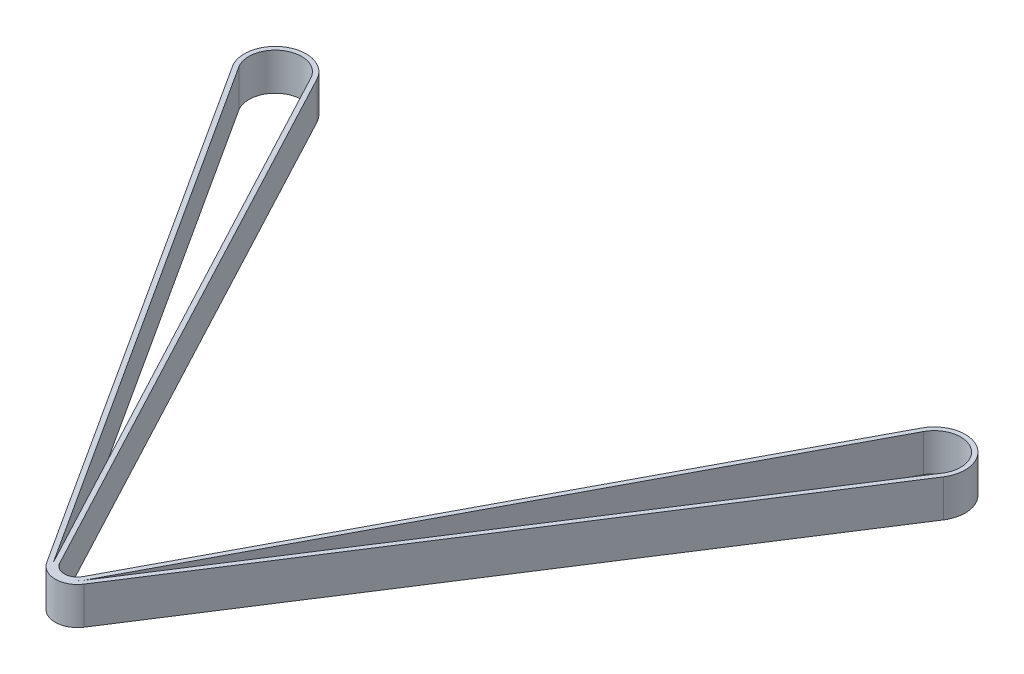
ISO-10303-21;
HEADER;
FILE_DESCRIPTION(('STEP AP214'),'2;1');
FILE_NAME('part.step','',(''),(''),'','','');
FILE_SCHEMA(('AUTOMOTIVE_DESIGN { 1 0 10303 214 1 1 1 1 }'));
ENDSEC;
DATA;
#1=APPLICATION_CONTEXT('core data for automotive mechanical design processes');
#2=APPLICATION_PROTOCOL_DEFINITION('international standard','automotive_design',2000,#1);
#3=PRODUCT_CONTEXT('',#1,'mechanical');
#4=PRODUCT('Part','Part','',(#3));
#5=PRODUCT_RELATED_PRODUCT_CATEGORY('part','',(#4));
#6=PRODUCT_DEFINITION_FORMATION('','',#4);
#7=PRODUCT_DEFINITION_CONTEXT('part definition',#1,'design');
#8=PRODUCT_DEFINITION('design','',#6,#7);
#9=PRODUCT_DEFINITION_SHAPE('','',#8);
#10=(LENGTH_UNIT() NAMED_UNIT(*) SI_UNIT(.MILLI.,.METRE.));
#11=(NAMED_UNIT(*) PLANE_ANGLE_UNIT() SI_UNIT($,.RADIAN.));
#12=(NAMED_UNIT(*) SI_UNIT($,.STERADIAN.) SOLID_ANGLE_UNIT());
#13=UNCERTAINTY_MEASURE_WITH_UNIT(LENGTH_MEASURE(1.E-05),#10,'distance_accuracy_value','');
#14=(GEOMETRIC_REPRESENTATION_CONTEXT(3) GLOBAL_UNCERTAINTY_ASSIGNED_CONTEXT((#13)) GLOBAL_UNIT_ASSIGNED_CONTEXT((#10,
#11,#12)) REPRESENTATION_CONTEXT('',''));
#15=CARTESIAN_POINT('',(0.,0.,0.));
#16=DIRECTION('',(0.,0.,1.));
#17=DIRECTION('',(1.,0.,0.));
#18=AXIS2_PLACEMENT_3D('',#15,#16,#17);
#19=CARTESIAN_POINT('',(0.,2.835,80.));
#20=DIRECTION('',(0.,1.,0.));
#21=DIRECTION('',(0.,0.,1.));
#22=AXIS2_PLACEMENT_3D('',#19,#20,#21);
#23=PLANE('',#22);
#24=CARTESIAN_POINT('',(0.,2.835,80.));
#25=DIRECTION('',(0.,1.,0.));
#26=DIRECTION('',(0.,0.,1.));
#27=AXIS2_PLACEMENT_3D('',#24,#25,#26);
#28=CIRCLE('',#27,3.38099999999999);
#29=CARTESIAN_POINT('',(-2.84194261261278,2.835,81.831535745383));
#30=VERTEX_POINT('',#29);
#31=CARTESIAN_POINT('',(2.84194261261276,2.835,81.831535745383));
#32=VERTEX_POINT('',#31);
#33=EDGE_CURVE('E262',#30,#32,#28,.T.);
#34=ORIENTED_EDGE('',*,*,#33,.T.);
#35=DIRECTION('',(0.54171421040609,0.,-0.840562736649744));
#36=VECTOR('',#35,1.);
#37=CARTESIAN_POINT('',(53.9422392348873,2.835,2.54063964680456));
#38=LINE('',#37,#36);
#39=CARTESIAN_POINT('',(53.9422392348873,2.835,2.54063964680456));
#40=VERTEX_POINT('',#39);
#41=EDGE_CURVE('E266',#32,#40,#38,.T.);
#42=ORIENTED_EDGE('',*,*,#41,.T.);
#43=CARTESIAN_POINT('',(50.,2.835,0.));
#44=DIRECTION('',(0.,1.,0.));
#45=DIRECTION('',(0.,0.,1.));
#46=AXIS2_PLACEMENT_3D('',#43,#44,#45);
#47=CIRCLE('',#46,4.69);
#48=CARTESIAN_POINT('',(45.85663033452,2.835,-2.19740479092502));
#49=VERTEX_POINT('',#48);
#50=EDGE_CURVE('E270',#40,#49,#47,.T.);
#51=ORIENTED_EDGE('',*,*,#50,.T.);
#52=DIRECTION('',(-0.468529806167377,0.,0.883447689867804));
#53=VECTOR('',#52,1.);
#54=CARTESIAN_POINT('',(1.76689537973561,2.835,80.9370596123348));
#55=LINE('',#54,#53);
#56=CARTESIAN_POINT('',(1.7668953797356,2.835,80.9370596123348));
#57=VERTEX_POINT('',#56);
#58=EDGE_CURVE('E273',#49,#57,#55,.T.);
#59=ORIENTED_EDGE('',*,*,#58,.T.);
#60=CARTESIAN_POINT('',(0.,2.835,80.));
#61=DIRECTION('',(0.,-1.,0.));
#62=DIRECTION('',(0.,0.,1.));
#63=AXIS2_PLACEMENT_3D('',#60,#61,#62);
#64=CIRCLE('',#63,2.);
#65=CARTESIAN_POINT('',(-1.76689537973559,2.835,80.9370596123348));
#66=VERTEX_POINT('',#65);
#67=EDGE_CURVE('E276',#57,#66,#64,.T.);
#68=ORIENTED_EDGE('',*,*,#67,.T.);
#69=DIRECTION('',(-0.468529806167378,0.,-0.883447689867804));
#70=VECTOR('',#69,1.);
#71=CARTESIAN_POINT('',(-45.85663033452,2.835,-2.197404790925));
#72=LINE('',#71,#70);
#73=CARTESIAN_POINT('',(-45.85663033452,2.835,-2.197404790925));
#74=VERTEX_POINT('',#73);
#75=EDGE_CURVE('E279',#66,#74,#72,.T.);
#76=ORIENTED_EDGE('',*,*,#75,.T.);
#77=CARTESIAN_POINT('',(-50.,2.835,0.));
#78=DIRECTION('',(0.,1.,0.));
#79=DIRECTION('',(0.,0.,1.));
#80=AXIS2_PLACEMENT_3D('',#77,#78,#79);
#81=CIRCLE('',#80,4.69);
#82=CARTESIAN_POINT('',(-53.9422392348873,2.835,2.54063964680456));
#83=VERTEX_POINT('',#82);
#84=EDGE_CURVE('E282',#74,#83,#81,.T.);
#85=ORIENTED_EDGE('',*,*,#84,.T.);
#86=DIRECTION('',(0.54171421040609,0.,0.840562736649744));
#87=VECTOR('',#86,1.);
#88=CARTESIAN_POINT('',(-2.84194261261278,2.835,81.831535745383));
#89=LINE('',#88,#87);
#90=EDGE_CURVE('E285',#83,#30,#89,.T.);
#91=ORIENTED_EDGE('',*,*,#90,.T.);
#92=EDGE_LOOP('',(#34,#42,#51,#59,#68,#76,#85,#91));
#93=FACE_BOUND('',#92,.T.);
#94=DIRECTION('',(0.54171421040609,0.,-0.840562736649744));
#95=VECTOR('',#94,1.);
#96=CARTESIAN_POINT('',(53.362250946599,2.835,2.16685684162436));
#97=LINE('',#96,#95);
#98=CARTESIAN_POINT('',(2.26195432432444,2.835,81.4577529402028));
#99=VERTEX_POINT('',#98);
#100=CARTESIAN_POINT('',(53.362250946599,2.835,2.16685684162436));
#101=VERTEX_POINT('',#100);
#102=EDGE_CURVE('E182',#99,#101,#97,.T.);
#103=ORIENTED_EDGE('',*,*,#102,.F.);
#104=CARTESIAN_POINT('',(0.,2.835,80.));
#105=DIRECTION('',(0.,1.,0.));
#106=DIRECTION('',(0.,0.,1.));
#107=AXIS2_PLACEMENT_3D('',#104,#105,#106);
#108=CIRCLE('',#107,2.691);
#109=CARTESIAN_POINT('',(-2.26195432432446,2.835,81.4577529402028));
#110=VERTEX_POINT('',#109);
#111=EDGE_CURVE('E173',#110,#99,#108,.T.);
#112=ORIENTED_EDGE('',*,*,#111,.F.);
#113=DIRECTION('',(0.54171421040609,0.,0.840562736649744));
#114=VECTOR('',#113,1.);
#115=CARTESIAN_POINT('',(-2.26195432432446,2.835,81.4577529402028));
#116=LINE('',#115,#114);
#117=CARTESIAN_POINT('',(-53.362250946599,2.835,2.16685684162436));
#118=VERTEX_POINT('',#117);
#119=EDGE_CURVE('E214',#118,#110,#116,.T.);
#120=ORIENTED_EDGE('',*,*,#119,.F.);
#121=CARTESIAN_POINT('',(-50.,2.835,0.));
#122=DIRECTION('',(0.,1.,0.));
#123=DIRECTION('',(0.,0.,1.));
#124=AXIS2_PLACEMENT_3D('',#121,#122,#123);
#125=CIRCLE('',#124,4.);
#126=CARTESIAN_POINT('',(-46.4662092405288,2.835,-1.87411922466951));
#127=VERTEX_POINT('',#126);
#128=EDGE_CURVE('E211',#127,#118,#125,.T.);
#129=ORIENTED_EDGE('',*,*,#128,.F.);
#130=DIRECTION('',(-0.468529806167378,0.,-0.883447689867804));
#131=VECTOR('',#130,1.);
#132=CARTESIAN_POINT('',(-46.4662092405288,2.835,-1.87411922466951));
#133=LINE('',#132,#131);
#134=CARTESIAN_POINT('',(-2.37647428574438,2.835,81.2603451785903));
#135=VERTEX_POINT('',#134);
#136=EDGE_CURVE('E208',#135,#127,#133,.T.);
#137=ORIENTED_EDGE('',*,*,#136,.F.);
#138=CARTESIAN_POINT('',(0.,2.835,80.));
#139=DIRECTION('',(0.,-1.,0.));
#140=DIRECTION('',(0.,0.,1.));
#141=AXIS2_PLACEMENT_3D('',#138,#139,#140);
#142=CIRCLE('',#141,2.69);
#143=CARTESIAN_POINT('',(2.37647428574439,2.835,81.2603451785903));
#144=VERTEX_POINT('',#143);
#145=EDGE_CURVE('E205',#144,#135,#142,.T.);
#146=ORIENTED_EDGE('',*,*,#145,.F.);
#147=DIRECTION('',(-0.468529806167377,0.,0.883447689867804));
#148=VECTOR('',#147,1.);
#149=CARTESIAN_POINT('',(2.37647428574439,2.835,81.2603451785903));
#150=LINE('',#149,#148);
#151=CARTESIAN_POINT('',(46.4662092405288,2.835,-1.87411922466953));
#152=VERTEX_POINT('',#151);
#153=EDGE_CURVE('E200',#152,#144,#150,.T.);
#154=ORIENTED_EDGE('',*,*,#153,.F.);
#155=CARTESIAN_POINT('',(50.,2.835,0.));
#156=DIRECTION('',(0.,1.,0.));
#157=DIRECTION('',(0.,0.,1.));
#158=AXIS2_PLACEMENT_3D('',#155,#156,#157);
#159=CIRCLE('',#158,4.);
#160=EDGE_CURVE('E196',#101,#152,#159,.T.);
#161=ORIENTED_EDGE('',*,*,#160,.F.);
#162=EDGE_LOOP('',(#103,#112,#120,#129,#137,#146,#154,#161));
#163=FACE_BOUND('',#162,.T.);
#164=ADVANCED_FACE('F43',(#93,#163),#23,.T.);
#165=CARTESIAN_POINT('',(0.,-2.835,80.));
#166=DIRECTION('',(0.,1.,0.));
#167=DIRECTION('',(0.,0.,1.));
#168=AXIS2_PLACEMENT_3D('',#165,#166,#167);
#169=PLANE('',#168);
#170=CARTESIAN_POINT('',(0.,-2.835,80.));
#171=DIRECTION('',(0.,1.,0.));
#172=DIRECTION('',(0.,0.,1.));
#173=AXIS2_PLACEMENT_3D('',#170,#171,#172);
#174=CIRCLE('',#173,3.38099999999999);
#175=CARTESIAN_POINT('',(-2.84194261261278,-2.835,81.831535745383));
#176=VERTEX_POINT('',#175);
#177=CARTESIAN_POINT('',(2.84194261261276,-2.835,81.831535745383));
#178=VERTEX_POINT('',#177);
#179=EDGE_CURVE('E191',#176,#178,#174,.T.);
#180=ORIENTED_EDGE('',*,*,#179,.F.);
#181=DIRECTION('',(0.54171421040609,0.,0.840562736649744));
#182=VECTOR('',#181,1.);
#183=CARTESIAN_POINT('',(-2.84194261261278,-2.835,81.831535745383));
#184=LINE('',#183,#182);
#185=CARTESIAN_POINT('',(-53.9422392348873,-2.835,2.54063964680456));
#186=VERTEX_POINT('',#185);
#187=EDGE_CURVE('E267',#186,#176,#184,.T.);
#188=ORIENTED_EDGE('',*,*,#187,.F.);
#189=CARTESIAN_POINT('',(-50.,-2.835,0.));
#190=DIRECTION('',(0.,1.,0.));
#191=DIRECTION('',(0.,0.,1.));
#192=AXIS2_PLACEMENT_3D('',#189,#190,#191);
#193=CIRCLE('',#192,4.69);
#194=CARTESIAN_POINT('',(-45.85663033452,-2.835,-2.197404790925));
#195=VERTEX_POINT('',#194);
#196=EDGE_CURVE('E307',#195,#186,#193,.T.);
#197=ORIENTED_EDGE('',*,*,#196,.F.);
#198=DIRECTION('',(-0.468529806167378,0.,-0.883447689867804));
#199=VECTOR('',#198,1.);
#200=CARTESIAN_POINT('',(-45.85663033452,-2.835,-2.197404790925));
#201=LINE('',#200,#199);
#202=CARTESIAN_POINT('',(-1.76689537973559,-2.835,80.9370596123348));
#203=VERTEX_POINT('',#202);
#204=EDGE_CURVE('E304',#203,#195,#201,.T.);
#205=ORIENTED_EDGE('',*,*,#204,.F.);
#206=CARTESIAN_POINT('',(0.,-2.835,80.));
#207=DIRECTION('',(0.,-1.,0.));
#208=DIRECTION('',(0.,0.,1.));
#209=AXIS2_PLACEMENT_3D('',#206,#207,#208);
#210=CIRCLE('',#209,2.);
#211=CARTESIAN_POINT('',(1.7668953797356,-2.835,80.9370596123348));
#212=VERTEX_POINT('',#211);
#213=EDGE_CURVE('E301',#212,#203,#210,.T.);
#214=ORIENTED_EDGE('',*,*,#213,.F.);
#215=DIRECTION('',(-0.468529806167377,0.,0.883447689867804));
#216=VECTOR('',#215,1.);
#217=CARTESIAN_POINT('',(1.76689537973561,-2.835,80.9370596123348));
#218=LINE('',#217,#216);
#219=CARTESIAN_POINT('',(45.85663033452,-2.835,-2.19740479092502));
#220=VERTEX_POINT('',#219);
#221=EDGE_CURVE('E298',#220,#212,#218,.T.);
#222=ORIENTED_EDGE('',*,*,#221,.F.);
#223=CARTESIAN_POINT('',(50.,-2.835,0.));
#224=DIRECTION('',(0.,1.,0.));
#225=DIRECTION('',(0.,0.,1.));
#226=AXIS2_PLACEMENT_3D('',#223,#224,#225);
#227=CIRCLE('',#226,4.69);
#228=CARTESIAN_POINT('',(53.9422392348873,-2.835,2.54063964680456));
#229=VERTEX_POINT('',#228);
#230=EDGE_CURVE('E295',#229,#220,#227,.T.);
#231=ORIENTED_EDGE('',*,*,#230,.F.);
#232=DIRECTION('',(0.54171421040609,0.,-0.840562736649744));
#233=VECTOR('',#232,1.);
#234=CARTESIAN_POINT('',(53.9422392348873,-2.835,2.54063964680456));
#235=LINE('',#234,#233);
#236=EDGE_CURVE('E292',#178,#229,#235,.T.);
#237=ORIENTED_EDGE('',*,*,#236,.F.);
#238=EDGE_LOOP('',(#180,#188,#197,#205,#214,#222,#231,#237));
#239=FACE_BOUND('',#238,.T.);
#240=CARTESIAN_POINT('',(0.,-2.835,80.));
#241=DIRECTION('',(0.,1.,0.));
#242=DIRECTION('',(0.,0.,1.));
#243=AXIS2_PLACEMENT_3D('',#240,#241,#242);
#244=CIRCLE('',#243,2.691);
#245=CARTESIAN_POINT('',(-2.26195432432445,-2.835,81.4577529402028));
#246=VERTEX_POINT('',#245);
#247=CARTESIAN_POINT('',(2.26195432432444,-2.835,81.4577529402028));
#248=VERTEX_POINT('',#247);
#249=EDGE_CURVE('E70',#246,#248,#244,.T.);
#250=ORIENTED_EDGE('',*,*,#249,.T.);
#251=DIRECTION('',(0.54171421040609,0.,-0.840562736649744));
#252=VECTOR('',#251,1.);
#253=CARTESIAN_POINT('',(53.362250946599,-2.835,2.16685684162436));
#254=LINE('',#253,#252);
#255=CARTESIAN_POINT('',(53.362250946599,-2.835,2.16685684162436));
#256=VERTEX_POINT('',#255);
#257=EDGE_CURVE('E189',#248,#256,#254,.T.);
#258=ORIENTED_EDGE('',*,*,#257,.T.);
#259=CARTESIAN_POINT('',(50.,-2.835,0.));
#260=DIRECTION('',(0.,1.,0.));
#261=DIRECTION('',(0.,0.,1.));
#262=AXIS2_PLACEMENT_3D('',#259,#260,#261);
#263=CIRCLE('',#262,4.);
#264=CARTESIAN_POINT('',(46.4662092405288,-2.835,-1.87411922466953));
#265=VERTEX_POINT('',#264);
#266=EDGE_CURVE('E221',#256,#265,#263,.T.);
#267=ORIENTED_EDGE('',*,*,#266,.T.);
#268=DIRECTION('',(-0.468529806167377,0.,0.883447689867804));
#269=VECTOR('',#268,1.);
#270=CARTESIAN_POINT('',(2.37647428574439,-2.835,81.2603451785903));
#271=LINE('',#270,#269);
#272=CARTESIAN_POINT('',(2.37647428574439,-2.835,81.2603451785903));
#273=VERTEX_POINT('',#272);
#274=EDGE_CURVE('E225',#265,#273,#271,.T.);
#275=ORIENTED_EDGE('',*,*,#274,.T.);
#276=CARTESIAN_POINT('',(0.,-2.835,80.));
#277=DIRECTION('',(0.,-1.,0.));
#278=DIRECTION('',(0.,0.,1.));
#279=AXIS2_PLACEMENT_3D('',#276,#277,#278);
#280=CIRCLE('',#279,2.69);
#281=CARTESIAN_POINT('',(-2.37647428574438,-2.835,81.2603451785903));
#282=VERTEX_POINT('',#281);
#283=EDGE_CURVE('E229',#273,#282,#280,.T.);
#284=ORIENTED_EDGE('',*,*,#283,.T.);
#285=DIRECTION('',(-0.468529806167378,0.,-0.883447689867804));
#286=VECTOR('',#285,1.);
#287=CARTESIAN_POINT('',(-46.4662092405288,-2.835,-1.87411922466951));
#288=LINE('',#287,#286);
#289=CARTESIAN_POINT('',(-46.4662092405288,-2.835,-1.87411922466951));
#290=VERTEX_POINT('',#289);
#291=EDGE_CURVE('E233',#282,#290,#288,.T.);
#292=ORIENTED_EDGE('',*,*,#291,.T.);
#293=CARTESIAN_POINT('',(-50.,-2.835,0.));
#294=DIRECTION('',(0.,1.,0.));
#295=DIRECTION('',(0.,0.,1.));
#296=AXIS2_PLACEMENT_3D('',#293,#294,#295);
#297=CIRCLE('',#296,4.);
#298=CARTESIAN_POINT('',(-53.362250946599,-2.835,2.16685684162436));
#299=VERTEX_POINT('',#298);
#300=EDGE_CURVE('E237',#290,#299,#297,.T.);
#301=ORIENTED_EDGE('',*,*,#300,.T.);
#302=DIRECTION('',(0.54171421040609,0.,0.840562736649744));
#303=VECTOR('',#302,1.);
#304=CARTESIAN_POINT('',(-2.26195432432446,-2.835,81.4577529402028));
#305=LINE('',#304,#303);
#306=EDGE_CURVE('E183',#299,#246,#305,.T.);
#307=ORIENTED_EDGE('',*,*,#306,.T.);
#308=EDGE_LOOP('',(#250,#258,#267,#275,#284,#292,#301,#307));
#309=FACE_BOUND('',#308,.T.);
#310=ADVANCED_FACE('F346',(#239,#309),#169,.F.);
#311=CARTESIAN_POINT('',(0.,2.835,80.));
#312=DIRECTION('',(0.,-1.,0.));
#313=DIRECTION('',(0.,0.,-1.));
#314=AXIS2_PLACEMENT_3D('',#311,#312,#313);
#315=CYLINDRICAL_SURFACE('',#314,3.38099999999999);
#316=ORIENTED_EDGE('',*,*,#179,.T.);
#317=DIRECTION('',(0.,-1.,0.));
#318=VECTOR('',#317,1.);
#319=CARTESIAN_POINT('',(2.84194261261276,2.835,81.831535745383));
#320=LINE('',#319,#318);
#321=EDGE_CURVE('E11',#32,#178,#320,.T.);
#322=ORIENTED_EDGE('',*,*,#321,.F.);
#323=ORIENTED_EDGE('',*,*,#33,.F.);
#324=DIRECTION('',(0.,-1.,0.));
#325=VECTOR('',#324,1.);
#326=CARTESIAN_POINT('',(-2.84194261261278,2.835,81.831535745383));
#327=LINE('',#326,#325);
#328=EDGE_CURVE('E288',#30,#176,#327,.T.);
#329=ORIENTED_EDGE('',*,*,#328,.T.);
#330=EDGE_LOOP('',(#316,#322,#323,#329));
#331=FACE_BOUND('',#330,.T.);
#332=ADVANCED_FACE('F45',(#331),#315,.T.);
#333=CARTESIAN_POINT('',(53.9422392348873,2.835,2.54063964680456));
#334=DIRECTION('',(-0.840562736649744,0.,-0.54171421040609));
#335=DIRECTION('',(-0.54171421040609,0.,0.840562736649744));
#336=AXIS2_PLACEMENT_3D('',#333,#334,#335);
#337=PLANE('',#336);
#338=ORIENTED_EDGE('',*,*,#236,.T.);
#339=DIRECTION('',(0.,-1.,0.));
#340=VECTOR('',#339,1.);
#341=CARTESIAN_POINT('',(53.9422392348873,2.835,2.54063964680456));
#342=LINE('',#341,#340);
#343=EDGE_CURVE('E52',#40,#229,#342,.T.);
#344=ORIENTED_EDGE('',*,*,#343,.F.);
#345=ORIENTED_EDGE('',*,*,#41,.F.);
#346=ORIENTED_EDGE('',*,*,#321,.T.);
#347=EDGE_LOOP('',(#338,#344,#345,#346));
#348=FACE_BOUND('',#347,.T.);
#349=ADVANCED_FACE('F363',(#348),#337,.F.);
#350=CARTESIAN_POINT('',(50.,2.835,0.));
#351=DIRECTION('',(0.,-1.,0.));
#352=DIRECTION('',(0.,0.,-1.));
#353=AXIS2_PLACEMENT_3D('',#350,#351,#352);
#354=CYLINDRICAL_SURFACE('',#353,4.69);
#355=ORIENTED_EDGE('',*,*,#230,.T.);
#356=DIRECTION('',(0.,-1.,0.));
#357=VECTOR('',#356,1.);
#358=CARTESIAN_POINT('',(45.85663033452,2.835,-2.19740479092502));
#359=LINE('',#358,#357);
#360=EDGE_CURVE('E331',#49,#220,#359,.T.);
#361=ORIENTED_EDGE('',*,*,#360,.F.);
#362=ORIENTED_EDGE('',*,*,#50,.F.);
#363=ORIENTED_EDGE('',*,*,#343,.T.);
#364=EDGE_LOOP('',(#355,#361,#362,#363));
#365=FACE_BOUND('',#364,.T.);
#366=ADVANCED_FACE('F340',(#365),#354,.T.);
#367=CARTESIAN_POINT('',(1.76689537973561,2.835,80.9370596123348));
#368=DIRECTION('',(0.883447689867804,0.,0.468529806167377));
#369=DIRECTION('',(0.468529806167378,0.,-0.883447689867804));
#370=AXIS2_PLACEMENT_3D('',#367,#368,#369);
#371=PLANE('',#370);
#372=ORIENTED_EDGE('',*,*,#221,.T.);
#373=DIRECTION('',(0.,-1.,0.));
#374=VECTOR('',#373,1.);
#375=CARTESIAN_POINT('',(1.7668953797356,2.835,80.9370596123348));
#376=LINE('',#375,#374);
#377=EDGE_CURVE('E327',#57,#212,#376,.T.);
#378=ORIENTED_EDGE('',*,*,#377,.F.);
#379=ORIENTED_EDGE('',*,*,#58,.F.);
#380=ORIENTED_EDGE('',*,*,#360,.T.);
#381=EDGE_LOOP('',(#372,#378,#379,#380));
#382=FACE_BOUND('',#381,.T.);
#383=ADVANCED_FACE('F352',(#382),#371,.F.);
#384=CARTESIAN_POINT('',(0.,2.835,80.));
#385=DIRECTION('',(0.,-1.,0.));
#386=DIRECTION('',(0.,0.,-1.));
#387=AXIS2_PLACEMENT_3D('',#384,#385,#386);
#388=CYLINDRICAL_SURFACE('',#387,2.);
#389=ORIENTED_EDGE('',*,*,#213,.T.);
#390=DIRECTION('',(0.,-1.,0.));
#391=VECTOR('',#390,1.);
#392=CARTESIAN_POINT('',(-1.76689537973559,2.835,80.9370596123348));
#393=LINE('',#392,#391);
#394=EDGE_CURVE('E323',#66,#203,#393,.T.);
#395=ORIENTED_EDGE('',*,*,#394,.F.);
#396=ORIENTED_EDGE('',*,*,#67,.F.);
#397=ORIENTED_EDGE('',*,*,#377,.T.);
#398=EDGE_LOOP('',(#389,#395,#396,#397));
#399=FACE_BOUND('',#398,.T.);
#400=ADVANCED_FACE('F356',(#399),#388,.F.);
#401=CARTESIAN_POINT('',(-45.85663033452,2.835,-2.197404790925));
#402=DIRECTION('',(-0.883447689867804,0.,0.468529806167378));
#403=DIRECTION('',(0.468529806167378,0.,0.883447689867804));
#404=AXIS2_PLACEMENT_3D('',#401,#402,#403);
#405=PLANE('',#404);
#406=ORIENTED_EDGE('',*,*,#204,.T.);
#407=DIRECTION('',(0.,-1.,0.));
#408=VECTOR('',#407,1.);
#409=CARTESIAN_POINT('',(-45.85663033452,2.835,-2.197404790925));
#410=LINE('',#409,#408);
#411=EDGE_CURVE('E319',#74,#195,#410,.T.);
#412=ORIENTED_EDGE('',*,*,#411,.F.);
#413=ORIENTED_EDGE('',*,*,#75,.F.);
#414=ORIENTED_EDGE('',*,*,#394,.T.);
#415=EDGE_LOOP('',(#406,#412,#413,#414));
#416=FACE_BOUND('',#415,.T.);
#417=ADVANCED_FACE('F376',(#416),#405,.F.);
#418=CARTESIAN_POINT('',(-50.,2.835,0.));
#419=DIRECTION('',(0.,-1.,0.));
#420=DIRECTION('',(0.,0.,-1.));
#421=AXIS2_PLACEMENT_3D('',#418,#419,#420);
#422=CYLINDRICAL_SURFACE('',#421,4.69);
#423=ORIENTED_EDGE('',*,*,#196,.T.);
#424=DIRECTION('',(0.,-1.,0.));
#425=VECTOR('',#424,1.);
#426=CARTESIAN_POINT('',(-53.9422392348873,2.835,2.54063964680456));
#427=LINE('',#426,#425);
#428=EDGE_CURVE('E315',#83,#186,#427,.T.);
#429=ORIENTED_EDGE('',*,*,#428,.F.);
#430=ORIENTED_EDGE('',*,*,#84,.F.);
#431=ORIENTED_EDGE('',*,*,#411,.T.);
#432=EDGE_LOOP('',(#423,#429,#430,#431));
#433=FACE_BOUND('',#432,.T.);
#434=ADVANCED_FACE('F374',(#433),#422,.T.);
#435=CARTESIAN_POINT('',(-2.84194261261278,2.835,81.831535745383));
#436=DIRECTION('',(0.840562736649744,0.,-0.54171421040609));
#437=DIRECTION('',(-0.54171421040609,0.,-0.840562736649744));
#438=AXIS2_PLACEMENT_3D('',#435,#436,#437);
#439=PLANE('',#438);
#440=ORIENTED_EDGE('',*,*,#187,.T.);
#441=ORIENTED_EDGE('',*,*,#328,.F.);
#442=ORIENTED_EDGE('',*,*,#90,.F.);
#443=ORIENTED_EDGE('',*,*,#428,.T.);
#444=EDGE_LOOP('',(#440,#441,#442,#443));
#445=FACE_BOUND('',#444,.T.);
#446=ADVANCED_FACE('F369',(#445),#439,.F.);
#447=CARTESIAN_POINT('',(0.,2.835,80.));
#448=DIRECTION('',(0.,-1.,0.));
#449=DIRECTION('',(0.,0.,-1.));
#450=AXIS2_PLACEMENT_3D('',#447,#448,#449);
#451=CYLINDRICAL_SURFACE('',#450,2.691);
#452=ORIENTED_EDGE('',*,*,#249,.F.);
#453=DIRECTION('',(0.,-1.,0.));
#454=VECTOR('',#453,1.);
#455=CARTESIAN_POINT('',(-2.26195432432446,2.835,81.4577529402028));
#456=LINE('',#455,#454);
#457=EDGE_CURVE('E177',#110,#246,#456,.T.);
#458=ORIENTED_EDGE('',*,*,#457,.F.);
#459=ORIENTED_EDGE('',*,*,#111,.T.);
#460=DIRECTION('',(0.,-1.,0.));
#461=VECTOR('',#460,1.);
#462=CARTESIAN_POINT('',(2.26195432432444,2.835,81.4577529402028));
#463=LINE('',#462,#461);
#464=EDGE_CURVE('E176',#99,#248,#463,.T.);
#465=ORIENTED_EDGE('',*,*,#464,.T.);
#466=EDGE_LOOP('',(#452,#458,#459,#465));
#467=FACE_BOUND('',#466,.T.);
#468=ADVANCED_FACE('F175',(#467),#451,.F.);
#469=CARTESIAN_POINT('',(53.362250946599,2.835,2.16685684162436));
#470=DIRECTION('',(-0.840562736649744,0.,-0.54171421040609));
#471=DIRECTION('',(-0.54171421040609,0.,0.840562736649744));
#472=AXIS2_PLACEMENT_3D('',#469,#470,#471);
#473=PLANE('',#472);
#474=ORIENTED_EDGE('',*,*,#257,.F.);
#475=ORIENTED_EDGE('',*,*,#464,.F.);
#476=ORIENTED_EDGE('',*,*,#102,.T.);
#477=DIRECTION('',(0.,-1.,0.));
#478=VECTOR('',#477,1.);
#479=CARTESIAN_POINT('',(53.362250946599,2.835,2.16685684162436));
#480=LINE('',#479,#478);
#481=EDGE_CURVE('E192',#101,#256,#480,.T.);
#482=ORIENTED_EDGE('',*,*,#481,.T.);
#483=EDGE_LOOP('',(#474,#475,#476,#482));
#484=FACE_BOUND('',#483,.T.);
#485=ADVANCED_FACE('F186',(#484),#473,.T.);
#486=CARTESIAN_POINT('',(50.,2.835,0.));
#487=DIRECTION('',(0.,-1.,0.));
#488=DIRECTION('',(0.,0.,-1.));
#489=AXIS2_PLACEMENT_3D('',#486,#487,#488);
#490=CYLINDRICAL_SURFACE('',#489,4.);
#491=ORIENTED_EDGE('',*,*,#266,.F.);
#492=ORIENTED_EDGE('',*,*,#481,.F.);
#493=ORIENTED_EDGE('',*,*,#160,.T.);
#494=DIRECTION('',(0.,-1.,0.));
#495=VECTOR('',#494,1.);
#496=CARTESIAN_POINT('',(46.4662092405288,2.835,-1.87411922466953));
#497=LINE('',#496,#495);
#498=EDGE_CURVE('E257',#152,#265,#497,.T.);
#499=ORIENTED_EDGE('',*,*,#498,.T.);
#500=EDGE_LOOP('',(#491,#492,#493,#499));
#501=FACE_BOUND('',#500,.T.);
#502=ADVANCED_FACE('F401',(#501),#490,.F.);
#503=CARTESIAN_POINT('',(2.37647428574439,2.835,81.2603451785903));
#504=DIRECTION('',(0.883447689867804,0.,0.468529806167377));
#505=DIRECTION('',(0.468529806167378,0.,-0.883447689867804));
#506=AXIS2_PLACEMENT_3D('',#503,#504,#505);
#507=PLANE('',#506);
#508=ORIENTED_EDGE('',*,*,#274,.F.);
#509=ORIENTED_EDGE('',*,*,#498,.F.);
#510=ORIENTED_EDGE('',*,*,#153,.T.);
#511=DIRECTION('',(0.,-1.,0.));
#512=VECTOR('',#511,1.);
#513=CARTESIAN_POINT('',(2.37647428574439,2.835,81.2603451785903));
#514=LINE('',#513,#512);
#515=EDGE_CURVE('E254',#144,#273,#514,.T.);
#516=ORIENTED_EDGE('',*,*,#515,.T.);
#517=EDGE_LOOP('',(#508,#509,#510,#516));
#518=FACE_BOUND('',#517,.T.);
#519=ADVANCED_FACE('F405',(#518),#507,.T.);
#520=CARTESIAN_POINT('',(0.,2.835,80.));
#521=DIRECTION('',(0.,-1.,0.));
#522=DIRECTION('',(0.,0.,-1.));
#523=AXIS2_PLACEMENT_3D('',#520,#521,#522);
#524=CYLINDRICAL_SURFACE('',#523,2.69);
#525=ORIENTED_EDGE('',*,*,#283,.F.);
#526=ORIENTED_EDGE('',*,*,#515,.F.);
#527=ORIENTED_EDGE('',*,*,#145,.T.);
#528=DIRECTION('',(0.,-1.,0.));
#529=VECTOR('',#528,1.);
#530=CARTESIAN_POINT('',(-2.37647428574438,2.835,81.2603451785903));
#531=LINE('',#530,#529);
#532=EDGE_CURVE('E251',#135,#282,#531,.T.);
#533=ORIENTED_EDGE('',*,*,#532,.T.);
#534=EDGE_LOOP('',(#525,#526,#527,#533));
#535=FACE_BOUND('',#534,.T.);
#536=ADVANCED_FACE('F411',(#535),#524,.T.);
#537=CARTESIAN_POINT('',(-46.4662092405288,2.835,-1.87411922466951));
#538=DIRECTION('',(-0.883447689867804,0.,0.468529806167378));
#539=DIRECTION('',(0.468529806167378,0.,0.883447689867804));
#540=AXIS2_PLACEMENT_3D('',#537,#538,#539);
#541=PLANE('',#540);
#542=ORIENTED_EDGE('',*,*,#291,.F.);
#543=ORIENTED_EDGE('',*,*,#532,.F.);
#544=ORIENTED_EDGE('',*,*,#136,.T.);
#545=DIRECTION('',(0.,-1.,0.));
#546=VECTOR('',#545,1.);
#547=CARTESIAN_POINT('',(-46.4662092405288,2.835,-1.87411922466951));
#548=LINE('',#547,#546);
#549=EDGE_CURVE('E248',#127,#290,#548,.T.);
#550=ORIENTED_EDGE('',*,*,#549,.T.);
#551=EDGE_LOOP('',(#542,#543,#544,#550));
#552=FACE_BOUND('',#551,.T.);
#553=ADVANCED_FACE('F415',(#552),#541,.T.);
#554=CARTESIAN_POINT('',(-50.,2.835,0.));
#555=DIRECTION('',(0.,-1.,0.));
#556=DIRECTION('',(0.,0.,-1.));
#557=AXIS2_PLACEMENT_3D('',#554,#555,#556);
#558=CYLINDRICAL_SURFACE('',#557,4.);
#559=ORIENTED_EDGE('',*,*,#300,.F.);
#560=ORIENTED_EDGE('',*,*,#549,.F.);
#561=ORIENTED_EDGE('',*,*,#128,.T.);
#562=DIRECTION('',(0.,-1.,0.));
#563=VECTOR('',#562,1.);
#564=CARTESIAN_POINT('',(-53.362250946599,2.835,2.16685684162436));
#565=LINE('',#564,#563);
#566=EDGE_CURVE('E59',#118,#299,#565,.T.);
#567=ORIENTED_EDGE('',*,*,#566,.T.);
#568=EDGE_LOOP('',(#559,#560,#561,#567));
#569=FACE_BOUND('',#568,.T.);
#570=ADVANCED_FACE('F419',(#569),#558,.F.);
#571=CARTESIAN_POINT('',(-2.26195432432446,2.835,81.4577529402028));
#572=DIRECTION('',(0.840562736649744,0.,-0.54171421040609));
#573=DIRECTION('',(-0.54171421040609,0.,-0.840562736649744));
#574=AXIS2_PLACEMENT_3D('',#571,#572,#573);
#575=PLANE('',#574);
#576=ORIENTED_EDGE('',*,*,#306,.F.);
#577=ORIENTED_EDGE('',*,*,#566,.F.);
#578=ORIENTED_EDGE('',*,*,#119,.T.);
#579=ORIENTED_EDGE('',*,*,#457,.T.);
#580=EDGE_LOOP('',(#576,#577,#578,#579));
#581=FACE_BOUND('',#580,.T.);
#582=ADVANCED_FACE('F423',(#581),#575,.T.);
#583=CLOSED_SHELL('',(#164,#310,#332,#349,#366,#383,#400,#417,#434,#446,#468,#485,#502,#519,
#536,#553,#570,#582));
#584=MANIFOLD_SOLID_BREP('B2',#583);
#585=ADVANCED_BREP_SHAPE_REPRESENTATION('',(#18,#584),#14);
#586=SHAPE_DEFINITION_REPRESENTATION(#9,#585);
ENDSEC;
END-ISO-10303-21;
